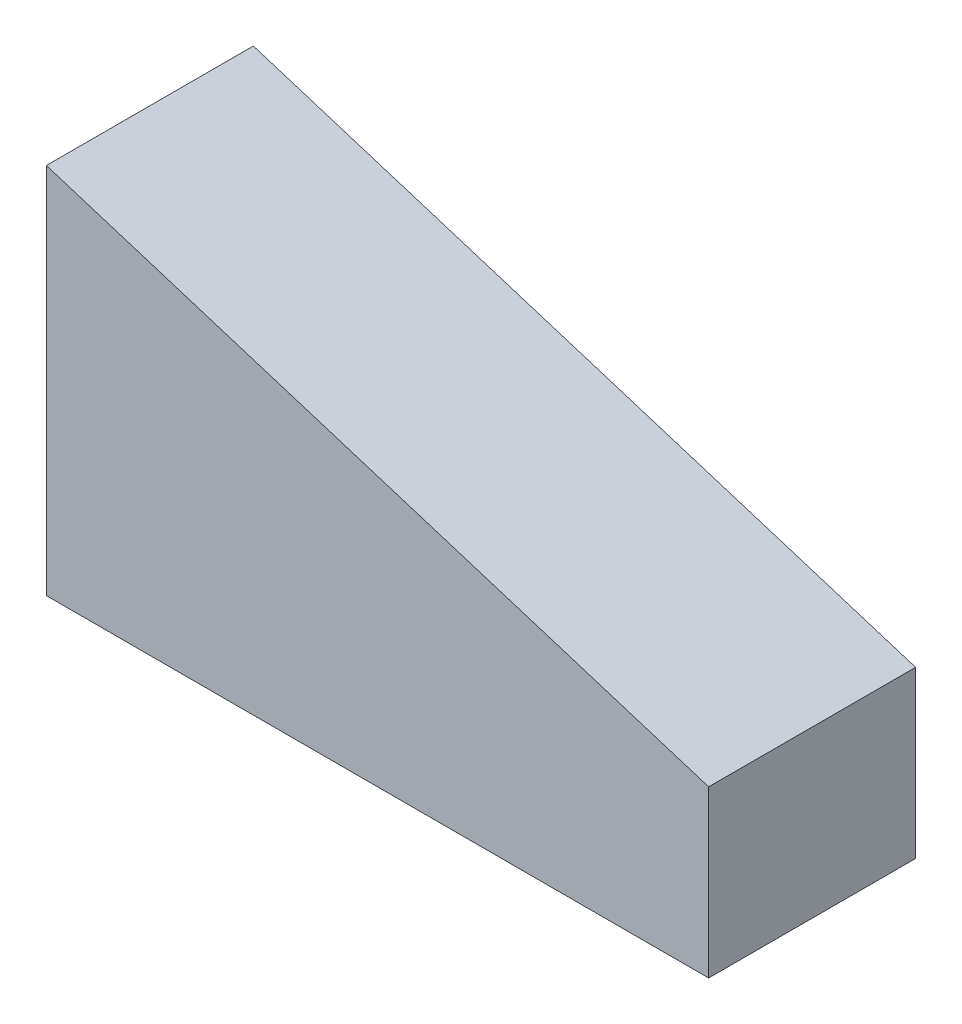
ISO-10303-21;
HEADER;
FILE_DESCRIPTION(('STEP AP214'),'2;1');
FILE_NAME('part.step','',(''),(''),'','','');
FILE_SCHEMA(('AUTOMOTIVE_DESIGN { 1 0 10303 214 1 1 1 1 }'));
ENDSEC;
DATA;
#1=APPLICATION_CONTEXT('core data for automotive mechanical design processes');
#2=APPLICATION_PROTOCOL_DEFINITION('international standard','automotive_design',2000,#1);
#3=PRODUCT_CONTEXT('',#1,'mechanical');
#4=PRODUCT('Part','Part','',(#3));
#5=PRODUCT_RELATED_PRODUCT_CATEGORY('part','',(#4));
#6=PRODUCT_DEFINITION_FORMATION('','',#4);
#7=PRODUCT_DEFINITION_CONTEXT('part definition',#1,'design');
#8=PRODUCT_DEFINITION('design','',#6,#7);
#9=PRODUCT_DEFINITION_SHAPE('','',#8);
#10=(LENGTH_UNIT() NAMED_UNIT(*) SI_UNIT(.MILLI.,.METRE.));
#11=(NAMED_UNIT(*) PLANE_ANGLE_UNIT() SI_UNIT($,.RADIAN.));
#12=(NAMED_UNIT(*) SI_UNIT($,.STERADIAN.) SOLID_ANGLE_UNIT());
#13=UNCERTAINTY_MEASURE_WITH_UNIT(LENGTH_MEASURE(1.E-05),#10,'distance_accuracy_value','');
#14=(GEOMETRIC_REPRESENTATION_CONTEXT(3) GLOBAL_UNCERTAINTY_ASSIGNED_CONTEXT((#13)) GLOBAL_UNIT_ASSIGNED_CONTEXT((#10,
#11,#12)) REPRESENTATION_CONTEXT('',''));
#15=CARTESIAN_POINT('',(0.,0.,0.));
#16=DIRECTION('',(0.,0.,1.));
#17=DIRECTION('',(1.,0.,0.));
#18=AXIS2_PLACEMENT_3D('',#15,#16,#17);
#19=CARTESIAN_POINT('',(80.,0.,25.));
#20=DIRECTION('',(0.,1.,0.));
#21=DIRECTION('',(-1.,0.,0.));
#22=AXIS2_PLACEMENT_3D('',#19,#20,#21);
#23=PLANE('',#22);
#24=DIRECTION('',(1.,0.,0.));
#25=VECTOR('',#24,1.);
#26=CARTESIAN_POINT('',(80.,0.,0.));
#27=LINE('',#26,#25);
#28=CARTESIAN_POINT('',(0.,0.,0.));
#29=VERTEX_POINT('',#28);
#30=CARTESIAN_POINT('',(80.,0.,0.));
#31=VERTEX_POINT('',#30);
#32=EDGE_CURVE('E107',#29,#31,#27,.T.);
#33=ORIENTED_EDGE('',*,*,#32,.T.);
#34=DIRECTION('',(0.,0.,-1.));
#35=VECTOR('',#34,1.);
#36=CARTESIAN_POINT('',(80.,0.,25.));
#37=LINE('',#36,#35);
#38=CARTESIAN_POINT('',(80.,0.,25.));
#39=VERTEX_POINT('',#38);
#40=EDGE_CURVE('E11',#39,#31,#37,.T.);
#41=ORIENTED_EDGE('',*,*,#40,.F.);
#42=DIRECTION('',(1.,0.,0.));
#43=VECTOR('',#42,1.);
#44=CARTESIAN_POINT('',(80.,0.,25.));
#45=LINE('',#44,#43);
#46=CARTESIAN_POINT('',(0.,0.,25.));
#47=VERTEX_POINT('',#46);
#48=EDGE_CURVE('E91',#47,#39,#45,.T.);
#49=ORIENTED_EDGE('',*,*,#48,.F.);
#50=DIRECTION('',(0.,0.,-1.));
#51=VECTOR('',#50,1.);
#52=CARTESIAN_POINT('',(0.,0.,25.));
#53=LINE('',#52,#51);
#54=EDGE_CURVE('E103',#47,#29,#53,.T.);
#55=ORIENTED_EDGE('',*,*,#54,.T.);
#56=EDGE_LOOP('',(#33,#41,#49,#55));
#57=FACE_BOUND('',#56,.T.);
#58=ADVANCED_FACE('F39',(#57),#23,.F.);
#59=CARTESIAN_POINT('',(80.,20.,25.));
#60=DIRECTION('',(-1.,0.,0.));
#61=DIRECTION('',(0.,0.,1.));
#62=AXIS2_PLACEMENT_3D('',#59,#60,#61);
#63=PLANE('',#62);
#64=DIRECTION('',(0.,1.,0.));
#65=VECTOR('',#64,1.);
#66=CARTESIAN_POINT('',(80.,20.,0.));
#67=LINE('',#66,#65);
#68=CARTESIAN_POINT('',(80.,20.,0.));
#69=VERTEX_POINT('',#68);
#70=EDGE_CURVE('E96',#31,#69,#67,.T.);
#71=ORIENTED_EDGE('',*,*,#70,.T.);
#72=DIRECTION('',(0.,0.,-1.));
#73=VECTOR('',#72,1.);
#74=CARTESIAN_POINT('',(80.,20.,25.));
#75=LINE('',#74,#73);
#76=CARTESIAN_POINT('',(80.,20.,25.));
#77=VERTEX_POINT('',#76);
#78=EDGE_CURVE('E48',#77,#69,#75,.T.);
#79=ORIENTED_EDGE('',*,*,#78,.F.);
#80=DIRECTION('',(0.,1.,0.));
#81=VECTOR('',#80,1.);
#82=CARTESIAN_POINT('',(80.,20.,25.));
#83=LINE('',#82,#81);
#84=EDGE_CURVE('E86',#39,#77,#83,.T.);
#85=ORIENTED_EDGE('',*,*,#84,.F.);
#86=ORIENTED_EDGE('',*,*,#40,.T.);
#87=EDGE_LOOP('',(#71,#79,#85,#86));
#88=FACE_BOUND('',#87,.T.);
#89=ADVANCED_FACE('F95',(#88),#63,.F.);
#90=CARTESIAN_POINT('',(0.,45.,25.));
#91=DIRECTION('',(-0.298274993135947,-0.95447997803503,0.));
#92=DIRECTION('',(0.95447997803503,-0.298274993135947,0.));
#93=AXIS2_PLACEMENT_3D('',#90,#91,#92);
#94=PLANE('',#93);
#95=DIRECTION('',(-0.95447997803503,0.298274993135947,0.));
#96=VECTOR('',#95,1.);
#97=CARTESIAN_POINT('',(0.,45.,0.));
#98=LINE('',#97,#96);
#99=CARTESIAN_POINT('',(0.,45.,0.));
#100=VERTEX_POINT('',#99);
#101=EDGE_CURVE('E73',#69,#100,#98,.T.);
#102=ORIENTED_EDGE('',*,*,#101,.T.);
#103=DIRECTION('',(0.,0.,-1.));
#104=VECTOR('',#103,1.);
#105=CARTESIAN_POINT('',(0.,45.,25.));
#106=LINE('',#105,#104);
#107=CARTESIAN_POINT('',(0.,45.,25.));
#108=VERTEX_POINT('',#107);
#109=EDGE_CURVE('E98',#108,#100,#106,.T.);
#110=ORIENTED_EDGE('',*,*,#109,.F.);
#111=DIRECTION('',(-0.95447997803503,0.298274993135947,0.));
#112=VECTOR('',#111,1.);
#113=CARTESIAN_POINT('',(0.,45.,25.));
#114=LINE('',#113,#112);
#115=EDGE_CURVE('E89',#77,#108,#114,.T.);
#116=ORIENTED_EDGE('',*,*,#115,.F.);
#117=ORIENTED_EDGE('',*,*,#78,.T.);
#118=EDGE_LOOP('',(#102,#110,#116,#117));
#119=FACE_BOUND('',#118,.T.);
#120=ADVANCED_FACE('F99',(#119),#94,.F.);
#121=CARTESIAN_POINT('',(0.,0.,25.));
#122=DIRECTION('',(1.,0.,0.));
#123=DIRECTION('',(0.,0.,-1.));
#124=AXIS2_PLACEMENT_3D('',#121,#122,#123);
#125=PLANE('',#124);
#126=DIRECTION('',(0.,-1.,0.));
#127=VECTOR('',#126,1.);
#128=CARTESIAN_POINT('',(0.,0.,0.));
#129=LINE('',#128,#127);
#130=EDGE_CURVE('E79',#100,#29,#129,.T.);
#131=ORIENTED_EDGE('',*,*,#130,.T.);
#132=ORIENTED_EDGE('',*,*,#54,.F.);
#133=DIRECTION('',(0.,-1.,0.));
#134=VECTOR('',#133,1.);
#135=CARTESIAN_POINT('',(0.,0.,25.));
#136=LINE('',#135,#134);
#137=EDGE_CURVE('E56',#108,#47,#136,.T.);
#138=ORIENTED_EDGE('',*,*,#137,.F.);
#139=ORIENTED_EDGE('',*,*,#109,.T.);
#140=EDGE_LOOP('',(#131,#132,#138,#139));
#141=FACE_BOUND('',#140,.T.);
#142=ADVANCED_FACE('F120',(#141),#125,.F.);
#143=CARTESIAN_POINT('',(0.,0.,25.));
#144=DIRECTION('',(0.,0.,-1.));
#145=DIRECTION('',(-1.,0.,0.));
#146=AXIS2_PLACEMENT_3D('',#143,#144,#145);
#147=PLANE('',#146);
#148=ORIENTED_EDGE('',*,*,#48,.T.);
#149=ORIENTED_EDGE('',*,*,#84,.T.);
#150=ORIENTED_EDGE('',*,*,#115,.T.);
#151=ORIENTED_EDGE('',*,*,#137,.T.);
#152=EDGE_LOOP('',(#148,#149,#150,#151));
#153=FACE_BOUND('',#152,.T.);
#154=ADVANCED_FACE('F87',(#153),#147,.F.);
#155=CARTESIAN_POINT('',(0.,0.,0.));
#156=DIRECTION('',(0.,0.,-1.));
#157=DIRECTION('',(-1.,0.,0.));
#158=AXIS2_PLACEMENT_3D('',#155,#156,#157);
#159=PLANE('',#158);
#160=ORIENTED_EDGE('',*,*,#32,.F.);
#161=ORIENTED_EDGE('',*,*,#130,.F.);
#162=ORIENTED_EDGE('',*,*,#101,.F.);
#163=ORIENTED_EDGE('',*,*,#70,.F.);
#164=EDGE_LOOP('',(#160,#161,#162,#163));
#165=FACE_BOUND('',#164,.T.);
#166=ADVANCED_FACE('F123',(#165),#159,.T.);
#167=CLOSED_SHELL('',(#58,#89,#120,#142,#154,#166));
#168=MANIFOLD_SOLID_BREP('B2',#167);
#169=ADVANCED_BREP_SHAPE_REPRESENTATION('',(#18,#168),#14);
#170=SHAPE_DEFINITION_REPRESENTATION(#9,#169);
ENDSEC;
END-ISO-10303-21;
